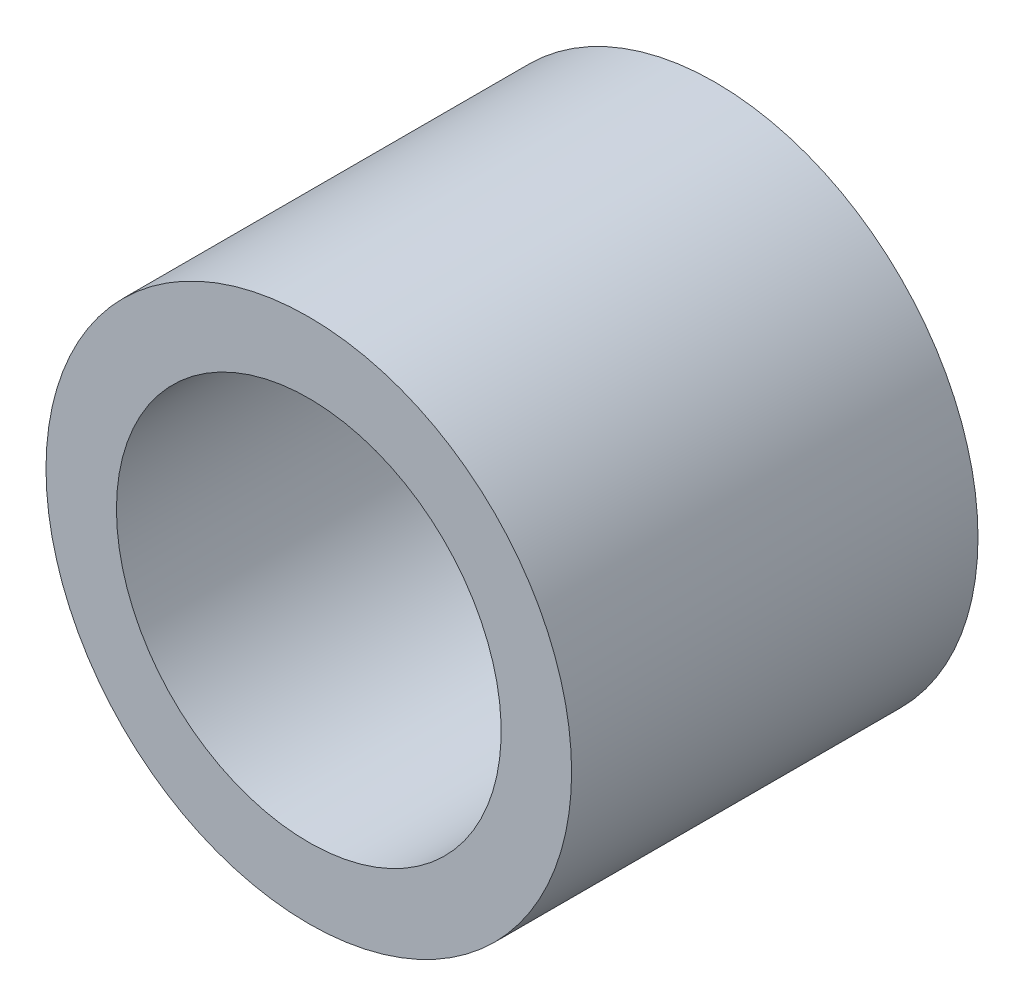
ISO-10303-21;
HEADER;
FILE_DESCRIPTION(('STEP AP214'),'2;1');
FILE_NAME('part.step','',(''),(''),'','','');
FILE_SCHEMA(('AUTOMOTIVE_DESIGN { 1 0 10303 214 1 1 1 1 }'));
ENDSEC;
DATA;
#1=APPLICATION_CONTEXT('core data for automotive mechanical design processes');
#2=APPLICATION_PROTOCOL_DEFINITION('international standard','automotive_design',2000,#1);
#3=PRODUCT_CONTEXT('',#1,'mechanical');
#4=PRODUCT('Part','Part','',(#3));
#5=PRODUCT_RELATED_PRODUCT_CATEGORY('part','',(#4));
#6=PRODUCT_DEFINITION_FORMATION('','',#4);
#7=PRODUCT_DEFINITION_CONTEXT('part definition',#1,'design');
#8=PRODUCT_DEFINITION('design','',#6,#7);
#9=PRODUCT_DEFINITION_SHAPE('','',#8);
#10=(LENGTH_UNIT() NAMED_UNIT(*) SI_UNIT(.MILLI.,.METRE.));
#11=(NAMED_UNIT(*) PLANE_ANGLE_UNIT() SI_UNIT($,.RADIAN.));
#12=(NAMED_UNIT(*) SI_UNIT($,.STERADIAN.) SOLID_ANGLE_UNIT());
#13=UNCERTAINTY_MEASURE_WITH_UNIT(LENGTH_MEASURE(1.E-05),#10,'distance_accuracy_value','');
#14=(GEOMETRIC_REPRESENTATION_CONTEXT(3) GLOBAL_UNCERTAINTY_ASSIGNED_CONTEXT((#13)) GLOBAL_UNIT_ASSIGNED_CONTEXT((#10,
#11,#12)) REPRESENTATION_CONTEXT('',''));
#15=CARTESIAN_POINT('',(0.,0.,0.));
#16=DIRECTION('',(0.,0.,1.));
#17=DIRECTION('',(1.,0.,0.));
#18=AXIS2_PLACEMENT_3D('',#15,#16,#17);
#19=CARTESIAN_POINT('',(0.,0.,19.05));
#20=DIRECTION('',(0.,0.,1.));
#21=DIRECTION('',(1.,0.,0.));
#22=AXIS2_PLACEMENT_3D('',#19,#20,#21);
#23=PLANE('',#22);
#24=CARTESIAN_POINT('',(0.,0.,19.05));
#25=DIRECTION('',(0.,0.,1.));
#26=DIRECTION('',(1.,0.,0.));
#27=AXIS2_PLACEMENT_3D('',#24,#25,#26);
#28=CIRCLE('',#27,12.319);
#29=CARTESIAN_POINT('',(-12.319,0.,19.05));
#30=VERTEX_POINT('',#29);
#31=EDGE_CURVE('E10',#30,#30,#28,.T.);
#32=ORIENTED_EDGE('',*,*,#31,.T.);
#33=EDGE_LOOP('',(#32));
#34=FACE_BOUND('',#33,.T.);
#35=CARTESIAN_POINT('',(0.,0.,19.05));
#36=DIRECTION('',(0.,0.,1.));
#37=DIRECTION('',(1.,0.,0.));
#38=AXIS2_PLACEMENT_3D('',#35,#36,#37);
#39=CIRCLE('',#38,9.017);
#40=CARTESIAN_POINT('',(-9.017,0.,19.05));
#41=VERTEX_POINT('',#40);
#42=EDGE_CURVE('E46',#41,#41,#39,.T.);
#43=ORIENTED_EDGE('',*,*,#42,.F.);
#44=EDGE_LOOP('',(#43));
#45=FACE_BOUND('',#44,.T.);
#46=ADVANCED_FACE('F35',(#34,#45),#23,.T.);
#47=CARTESIAN_POINT('',(0.,0.,0.));
#48=DIRECTION('',(0.,0.,1.));
#49=DIRECTION('',(1.,0.,0.));
#50=AXIS2_PLACEMENT_3D('',#47,#48,#49);
#51=PLANE('',#50);
#52=CARTESIAN_POINT('',(0.,0.,0.));
#53=DIRECTION('',(0.,0.,1.));
#54=DIRECTION('',(1.,0.,0.));
#55=AXIS2_PLACEMENT_3D('',#52,#53,#54);
#56=CIRCLE('',#55,12.319);
#57=CARTESIAN_POINT('',(-12.319,0.,0.));
#58=VERTEX_POINT('',#57);
#59=EDGE_CURVE('E39',#58,#58,#56,.T.);
#60=ORIENTED_EDGE('',*,*,#59,.F.);
#61=EDGE_LOOP('',(#60));
#62=FACE_BOUND('',#61,.T.);
#63=CARTESIAN_POINT('',(0.,0.,0.));
#64=DIRECTION('',(0.,0.,1.));
#65=DIRECTION('',(1.,0.,0.));
#66=AXIS2_PLACEMENT_3D('',#63,#64,#65);
#67=CIRCLE('',#66,9.017);
#68=CARTESIAN_POINT('',(-9.017,0.,0.));
#69=VERTEX_POINT('',#68);
#70=EDGE_CURVE('E48',#69,#69,#67,.T.);
#71=ORIENTED_EDGE('',*,*,#70,.T.);
#72=EDGE_LOOP('',(#71));
#73=FACE_BOUND('',#72,.T.);
#74=ADVANCED_FACE('F58',(#62,#73),#51,.F.);
#75=CARTESIAN_POINT('',(0.,0.,19.05));
#76=DIRECTION('',(0.,0.,-1.));
#77=DIRECTION('',(-1.,0.,0.));
#78=AXIS2_PLACEMENT_3D('',#75,#76,#77);
#79=CYLINDRICAL_SURFACE('',#78,12.319);
#80=CARTESIAN_POINT('',(-12.319,0.,19.05));
#81=CARTESIAN_POINT('',(-12.319,0.,18.8515625));
#82=CARTESIAN_POINT('',(-12.319,0.,18.653125));
#83=CARTESIAN_POINT('',(-12.319,0.,18.25625));
#84=CARTESIAN_POINT('',(-12.319,0.,18.0578125));
#85=CARTESIAN_POINT('',(-12.319,0.,17.6609375));
#86=CARTESIAN_POINT('',(-12.319,0.,17.4625));
#87=CARTESIAN_POINT('',(-12.319,0.,17.065625));
#88=CARTESIAN_POINT('',(-12.319,0.,16.8671875));
#89=CARTESIAN_POINT('',(-12.319,0.,16.4703125));
#90=CARTESIAN_POINT('',(-12.319,0.,16.271875));
#91=CARTESIAN_POINT('',(-12.319,0.,15.875));
#92=CARTESIAN_POINT('',(-12.319,0.,15.6765625));
#93=CARTESIAN_POINT('',(-12.319,0.,15.2796875));
#94=CARTESIAN_POINT('',(-12.319,0.,15.08125));
#95=CARTESIAN_POINT('',(-12.319,0.,14.684375));
#96=CARTESIAN_POINT('',(-12.319,0.,14.4859375));
#97=CARTESIAN_POINT('',(-12.319,0.,14.0890625));
#98=CARTESIAN_POINT('',(-12.319,0.,13.890625));
#99=CARTESIAN_POINT('',(-12.319,0.,13.49375));
#100=CARTESIAN_POINT('',(-12.319,0.,13.2953125));
#101=CARTESIAN_POINT('',(-12.319,0.,12.8984375));
#102=CARTESIAN_POINT('',(-12.319,0.,12.7));
#103=CARTESIAN_POINT('',(-12.319,0.,12.303125));
#104=CARTESIAN_POINT('',(-12.319,0.,12.1046875));
#105=CARTESIAN_POINT('',(-12.319,0.,11.7078125));
#106=CARTESIAN_POINT('',(-12.319,0.,11.509375));
#107=CARTESIAN_POINT('',(-12.319,0.,11.1125));
#108=CARTESIAN_POINT('',(-12.319,0.,10.9140625));
#109=CARTESIAN_POINT('',(-12.319,0.,10.5171875));
#110=CARTESIAN_POINT('',(-12.319,0.,10.31875));
#111=CARTESIAN_POINT('',(-12.319,0.,9.921875));
#112=CARTESIAN_POINT('',(-12.319,0.,9.7234375));
#113=CARTESIAN_POINT('',(-12.319,0.,9.3265625));
#114=CARTESIAN_POINT('',(-12.319,0.,9.128125));
#115=CARTESIAN_POINT('',(-12.319,0.,8.73125));
#116=CARTESIAN_POINT('',(-12.319,0.,8.5328125));
#117=CARTESIAN_POINT('',(-12.319,0.,8.1359375));
#118=CARTESIAN_POINT('',(-12.319,0.,7.9375));
#119=CARTESIAN_POINT('',(-12.319,0.,7.540625));
#120=CARTESIAN_POINT('',(-12.319,0.,7.3421875));
#121=CARTESIAN_POINT('',(-12.319,0.,6.9453125));
#122=CARTESIAN_POINT('',(-12.319,0.,6.746875));
#123=CARTESIAN_POINT('',(-12.319,0.,6.35));
#124=CARTESIAN_POINT('',(-12.319,0.,6.1515625));
#125=CARTESIAN_POINT('',(-12.319,0.,5.7546875));
#126=CARTESIAN_POINT('',(-12.319,0.,5.55625));
#127=CARTESIAN_POINT('',(-12.319,0.,5.159375));
#128=CARTESIAN_POINT('',(-12.319,0.,4.9609375));
#129=CARTESIAN_POINT('',(-12.319,0.,4.5640625));
#130=CARTESIAN_POINT('',(-12.319,0.,4.365625));
#131=CARTESIAN_POINT('',(-12.319,0.,3.96875));
#132=CARTESIAN_POINT('',(-12.319,0.,3.7703125));
#133=CARTESIAN_POINT('',(-12.319,0.,3.3734375));
#134=CARTESIAN_POINT('',(-12.319,0.,3.175));
#135=CARTESIAN_POINT('',(-12.319,0.,2.778125));
#136=CARTESIAN_POINT('',(-12.319,0.,2.5796875));
#137=CARTESIAN_POINT('',(-12.319,0.,2.1828125));
#138=CARTESIAN_POINT('',(-12.319,0.,1.984375));
#139=CARTESIAN_POINT('',(-12.319,0.,1.5875));
#140=CARTESIAN_POINT('',(-12.319,0.,1.3890625));
#141=CARTESIAN_POINT('',(-12.319,0.,0.992187500000001));
#142=CARTESIAN_POINT('',(-12.319,0.,0.793750000000001));
#143=CARTESIAN_POINT('',(-12.319,0.,0.396875));
#144=CARTESIAN_POINT('',(-12.319,0.,0.1984375));
#145=CARTESIAN_POINT('',(-12.319,0.,0.));
#146=B_SPLINE_CURVE_WITH_KNOTS('',3,(#80,#81,#82,#83,#84,#85,#86,#87,#88,#89,#90,#91,#92,#93,
#94,#95,#96,#97,#98,#99,#100,#101,#102,#103,#104,#105,#106,#107,#108,#109,#110,#111,#112,#113,
#114,#115,#116,#117,#118,#119,#120,#121,#122,#123,#124,#125,#126,#127,#128,#129,#130,#131,#132,
#133,#134,#135,#136,#137,#138,#139,#140,#141,#142,#143,#144,#145),.UNSPECIFIED.,.F.,.F.,(4,2,2,
2,2,2,2,2,2,2,2,2,2,2,2,2,2,2,2,2,2,2,2,2,2,2,2,2,2,2,2,2,4),(0.,0.595312499999997,1.190625,
1.7859375,2.38125,2.9765625,3.571875,4.1671875,4.7625,5.3578125,5.953125,6.5484375,7.14375,
7.7390625,8.334375,8.9296875,9.525,10.1203125,10.715625,11.3109375,11.90625,12.5015625,
13.096875,13.6921875,14.2875,14.8828125,15.478125,16.0734375,16.66875,17.2640625,17.859375,
18.4546875,19.05),.UNSPECIFIED.);
#147=EDGE_CURVE('BSEAM37',#30,#58,#146,.T.);
#148=ORIENTED_EDGE('',*,*,#31,.F.);
#149=ORIENTED_EDGE('',*,*,#59,.T.);
#150=ORIENTED_EDGE('',*,*,#147,.T.);
#151=ORIENTED_EDGE('',*,*,#147,.F.);
#152=EDGE_LOOP('',(#148,#150,#149,#151));
#153=FACE_BOUND('',#152,.T.);
#154=ADVANCED_FACE('F37',(#153),#79,.T.);
#155=CARTESIAN_POINT('',(0.,0.,19.05));
#156=DIRECTION('',(0.,0.,-1.));
#157=DIRECTION('',(-1.,0.,0.));
#158=AXIS2_PLACEMENT_3D('',#155,#156,#157);
#159=CYLINDRICAL_SURFACE('',#158,9.017);
#160=CARTESIAN_POINT('',(-9.017,0.,19.05));
#161=CARTESIAN_POINT('',(-9.017,0.,18.8515625));
#162=CARTESIAN_POINT('',(-9.017,0.,18.653125));
#163=CARTESIAN_POINT('',(-9.017,0.,18.25625));
#164=CARTESIAN_POINT('',(-9.017,0.,18.0578125));
#165=CARTESIAN_POINT('',(-9.017,0.,17.6609375));
#166=CARTESIAN_POINT('',(-9.017,0.,17.4625));
#167=CARTESIAN_POINT('',(-9.017,0.,17.065625));
#168=CARTESIAN_POINT('',(-9.017,0.,16.8671875));
#169=CARTESIAN_POINT('',(-9.017,0.,16.4703125));
#170=CARTESIAN_POINT('',(-9.017,0.,16.271875));
#171=CARTESIAN_POINT('',(-9.017,0.,15.875));
#172=CARTESIAN_POINT('',(-9.017,0.,15.6765625));
#173=CARTESIAN_POINT('',(-9.017,0.,15.2796875));
#174=CARTESIAN_POINT('',(-9.017,0.,15.08125));
#175=CARTESIAN_POINT('',(-9.017,0.,14.684375));
#176=CARTESIAN_POINT('',(-9.017,0.,14.4859375));
#177=CARTESIAN_POINT('',(-9.017,0.,14.0890625));
#178=CARTESIAN_POINT('',(-9.017,0.,13.890625));
#179=CARTESIAN_POINT('',(-9.017,0.,13.49375));
#180=CARTESIAN_POINT('',(-9.017,0.,13.2953125));
#181=CARTESIAN_POINT('',(-9.017,0.,12.8984375));
#182=CARTESIAN_POINT('',(-9.017,0.,12.7));
#183=CARTESIAN_POINT('',(-9.017,0.,12.303125));
#184=CARTESIAN_POINT('',(-9.017,0.,12.1046875));
#185=CARTESIAN_POINT('',(-9.017,0.,11.7078125));
#186=CARTESIAN_POINT('',(-9.017,0.,11.509375));
#187=CARTESIAN_POINT('',(-9.017,0.,11.1125));
#188=CARTESIAN_POINT('',(-9.017,0.,10.9140625));
#189=CARTESIAN_POINT('',(-9.017,0.,10.5171875));
#190=CARTESIAN_POINT('',(-9.017,0.,10.31875));
#191=CARTESIAN_POINT('',(-9.017,0.,9.921875));
#192=CARTESIAN_POINT('',(-9.017,0.,9.7234375));
#193=CARTESIAN_POINT('',(-9.017,0.,9.3265625));
#194=CARTESIAN_POINT('',(-9.017,0.,9.128125));
#195=CARTESIAN_POINT('',(-9.017,0.,8.73125));
#196=CARTESIAN_POINT('',(-9.017,0.,8.5328125));
#197=CARTESIAN_POINT('',(-9.017,0.,8.1359375));
#198=CARTESIAN_POINT('',(-9.017,0.,7.9375));
#199=CARTESIAN_POINT('',(-9.017,0.,7.540625));
#200=CARTESIAN_POINT('',(-9.017,0.,7.3421875));
#201=CARTESIAN_POINT('',(-9.017,0.,6.9453125));
#202=CARTESIAN_POINT('',(-9.017,0.,6.746875));
#203=CARTESIAN_POINT('',(-9.017,0.,6.35));
#204=CARTESIAN_POINT('',(-9.017,0.,6.1515625));
#205=CARTESIAN_POINT('',(-9.017,0.,5.7546875));
#206=CARTESIAN_POINT('',(-9.017,0.,5.55625));
#207=CARTESIAN_POINT('',(-9.017,0.,5.159375));
#208=CARTESIAN_POINT('',(-9.017,0.,4.9609375));
#209=CARTESIAN_POINT('',(-9.017,0.,4.5640625));
#210=CARTESIAN_POINT('',(-9.017,0.,4.365625));
#211=CARTESIAN_POINT('',(-9.017,0.,3.96875));
#212=CARTESIAN_POINT('',(-9.017,0.,3.7703125));
#213=CARTESIAN_POINT('',(-9.017,0.,3.3734375));
#214=CARTESIAN_POINT('',(-9.017,0.,3.175));
#215=CARTESIAN_POINT('',(-9.017,0.,2.778125));
#216=CARTESIAN_POINT('',(-9.017,0.,2.5796875));
#217=CARTESIAN_POINT('',(-9.017,0.,2.1828125));
#218=CARTESIAN_POINT('',(-9.017,0.,1.984375));
#219=CARTESIAN_POINT('',(-9.017,0.,1.5875));
#220=CARTESIAN_POINT('',(-9.017,0.,1.3890625));
#221=CARTESIAN_POINT('',(-9.017,0.,0.992187500000001));
#222=CARTESIAN_POINT('',(-9.017,0.,0.793750000000001));
#223=CARTESIAN_POINT('',(-9.017,0.,0.396875));
#224=CARTESIAN_POINT('',(-9.017,0.,0.1984375));
#225=CARTESIAN_POINT('',(-9.017,0.,0.));
#226=B_SPLINE_CURVE_WITH_KNOTS('',3,(#160,#161,#162,#163,#164,#165,#166,#167,#168,#169,#170,
#171,#172,#173,#174,#175,#176,#177,#178,#179,#180,#181,#182,#183,#184,#185,#186,#187,#188,#189,
#190,#191,#192,#193,#194,#195,#196,#197,#198,#199,#200,#201,#202,#203,#204,#205,#206,#207,#208,
#209,#210,#211,#212,#213,#214,#215,#216,#217,#218,#219,#220,#221,#222,#223,#224,#225),
.UNSPECIFIED.,.F.,.F.,(4,2,2,2,2,2,2,2,2,2,2,2,2,2,2,2,2,2,2,2,2,2,2,2,2,2,2,2,2,2,2,2,4),(0.,
0.5953125,1.190625,1.7859375,2.38125,2.9765625,3.571875,4.1671875,4.7625,5.3578125,5.953125,
6.5484375,7.14375,7.7390625,8.334375,8.9296875,9.525,10.1203125,10.715625,11.3109375,11.90625,
12.5015625,13.096875,13.6921875,14.2875,14.8828125,15.478125,16.0734375,16.66875,17.2640625,
17.859375,18.4546875,19.05),.UNSPECIFIED.);
#227=EDGE_CURVE('BSEAM54',#41,#69,#226,.T.);
#228=ORIENTED_EDGE('',*,*,#42,.T.);
#229=ORIENTED_EDGE('',*,*,#70,.F.);
#230=ORIENTED_EDGE('',*,*,#227,.T.);
#231=ORIENTED_EDGE('',*,*,#227,.F.);
#232=EDGE_LOOP('',(#228,#230,#229,#231));
#233=FACE_BOUND('',#232,.T.);
#234=ADVANCED_FACE('F54',(#233),#159,.F.);
#235=CLOSED_SHELL('',(#46,#74,#154,#234));
#236=MANIFOLD_SOLID_BREP('B2',#235);
#237=ADVANCED_BREP_SHAPE_REPRESENTATION('',(#18,#236),#14);
#238=SHAPE_DEFINITION_REPRESENTATION(#9,#237);
ENDSEC;
END-ISO-10303-21;
